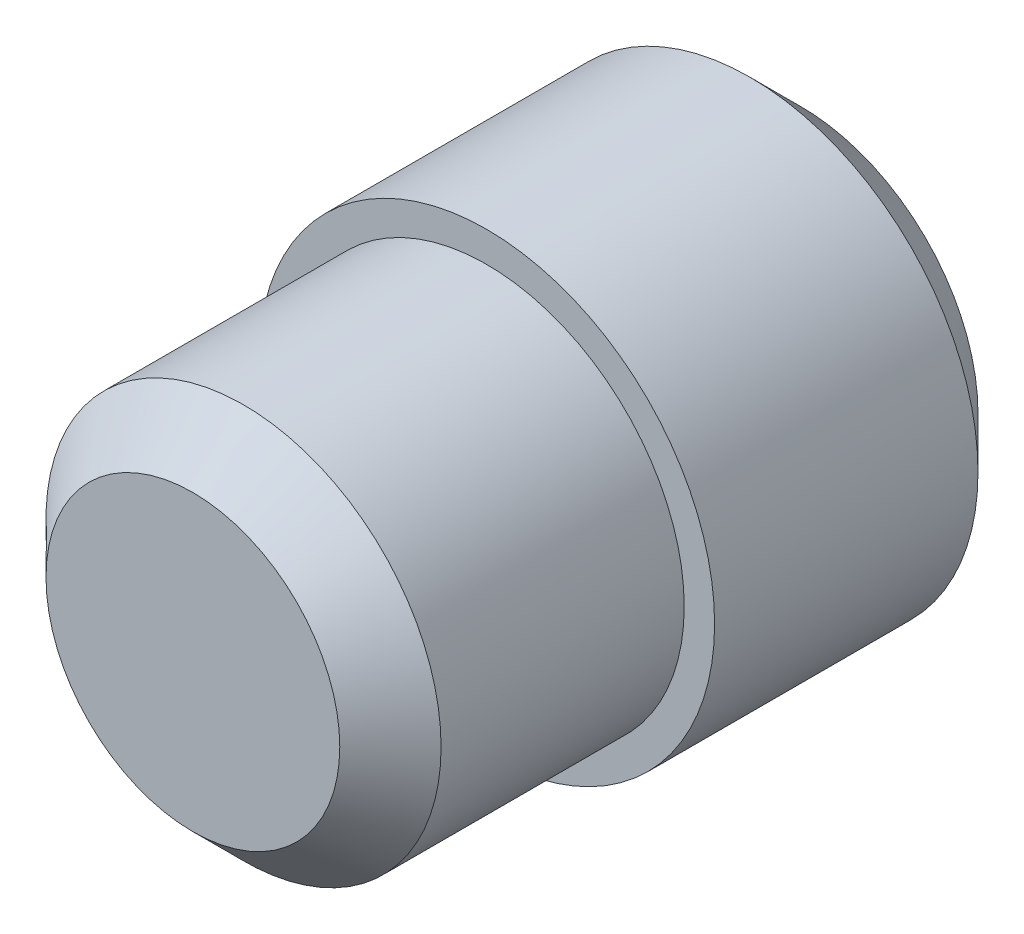
ISO-10303-21;
HEADER;
FILE_DESCRIPTION(('STEP AP214'),'2;1');
FILE_NAME('part.step','',(''),(''),'','','');
FILE_SCHEMA(('AUTOMOTIVE_DESIGN { 1 0 10303 214 1 1 1 1 }'));
ENDSEC;
DATA;
#1=APPLICATION_CONTEXT('core data for automotive mechanical design processes');
#2=APPLICATION_PROTOCOL_DEFINITION('international standard','automotive_design',2000,#1);
#3=PRODUCT_CONTEXT('',#1,'mechanical');
#4=PRODUCT('Part','Part','',(#3));
#5=PRODUCT_RELATED_PRODUCT_CATEGORY('part','',(#4));
#6=PRODUCT_DEFINITION_FORMATION('','',#4);
#7=PRODUCT_DEFINITION_CONTEXT('part definition',#1,'design');
#8=PRODUCT_DEFINITION('design','',#6,#7);
#9=PRODUCT_DEFINITION_SHAPE('','',#8);
#10=(LENGTH_UNIT() NAMED_UNIT(*) SI_UNIT(.MILLI.,.METRE.));
#11=(NAMED_UNIT(*) PLANE_ANGLE_UNIT() SI_UNIT($,.RADIAN.));
#12=(NAMED_UNIT(*) SI_UNIT($,.STERADIAN.) SOLID_ANGLE_UNIT());
#13=UNCERTAINTY_MEASURE_WITH_UNIT(LENGTH_MEASURE(1.E-05),#10,'distance_accuracy_value','');
#14=(GEOMETRIC_REPRESENTATION_CONTEXT(3) GLOBAL_UNCERTAINTY_ASSIGNED_CONTEXT((#13)) GLOBAL_UNIT_ASSIGNED_CONTEXT((#10,
#11,#12)) REPRESENTATION_CONTEXT('',''));
#15=CARTESIAN_POINT('',(0.,0.,0.));
#16=DIRECTION('',(0.,0.,1.));
#17=DIRECTION('',(1.,0.,0.));
#18=AXIS2_PLACEMENT_3D('',#15,#16,#17);
#19=CARTESIAN_POINT('',(0.,0.,3.1));
#20=DIRECTION('',(0.,0.,1.));
#21=DIRECTION('',(1.,0.,0.));
#22=AXIS2_PLACEMENT_3D('',#19,#20,#21);
#23=PLANE('',#22);
#24=CARTESIAN_POINT('',(0.,0.,3.1));
#25=DIRECTION('',(0.,0.,1.));
#26=DIRECTION('',(1.,0.,0.));
#27=AXIS2_PLACEMENT_3D('',#24,#25,#26);
#28=CIRCLE('',#27,2.25);
#29=CARTESIAN_POINT('',(-2.25,0.,3.1));
#30=VERTEX_POINT('',#29);
#31=EDGE_CURVE('E52',#30,#30,#28,.T.);
#32=ORIENTED_EDGE('',*,*,#31,.T.);
#33=EDGE_LOOP('',(#32));
#34=FACE_BOUND('',#33,.T.);
#35=CARTESIAN_POINT('',(0.,0.,3.1));
#36=DIRECTION('',(0.,0.,1.));
#37=DIRECTION('',(1.,0.,0.));
#38=AXIS2_PLACEMENT_3D('',#35,#36,#37);
#39=CIRCLE('',#38,1.95);
#40=CARTESIAN_POINT('',(1.95,0.,3.1));
#41=VERTEX_POINT('',#40);
#42=EDGE_CURVE('E55',#41,#41,#39,.T.);
#43=ORIENTED_EDGE('',*,*,#42,.F.);
#44=EDGE_LOOP('',(#43));
#45=FACE_BOUND('',#44,.T.);
#46=ADVANCED_FACE('F32',(#34,#45),#23,.T.);
#47=CARTESIAN_POINT('',(0.,0.,3.1));
#48=DIRECTION('',(0.,0.,-1.));
#49=DIRECTION('',(-1.,0.,0.));
#50=AXIS2_PLACEMENT_3D('',#47,#48,#49);
#51=CYLINDRICAL_SURFACE('',#50,2.25);
#52=CARTESIAN_POINT('',(0.,0.,0.500000000000005));
#53=DIRECTION('',(0.,0.,1.));
#54=DIRECTION('',(1.,0.,0.));
#55=AXIS2_PLACEMENT_3D('',#52,#53,#54);
#56=CIRCLE('',#55,2.25);
#57=CARTESIAN_POINT('',(-2.25,0.,0.500000000000005));
#58=VERTEX_POINT('',#57);
#59=EDGE_CURVE('E47',#58,#58,#56,.T.);
#60=CARTESIAN_POINT('',(-2.25,0.,0.500000000000005));
#61=CARTESIAN_POINT('',(-2.25,0.,0.527083333333338));
#62=CARTESIAN_POINT('',(-2.25,0.,0.554166666666671));
#63=CARTESIAN_POINT('',(-2.25,0.,0.608333333333338));
#64=CARTESIAN_POINT('',(-2.25,0.,0.635416666666671));
#65=CARTESIAN_POINT('',(-2.25,0.,0.689583333333338));
#66=CARTESIAN_POINT('',(-2.25,0.,0.716666666666671));
#67=CARTESIAN_POINT('',(-2.25,0.,0.770833333333338));
#68=CARTESIAN_POINT('',(-2.25,0.,0.797916666666671));
#69=CARTESIAN_POINT('',(-2.25,0.,0.852083333333337));
#70=CARTESIAN_POINT('',(-2.25,0.,0.879166666666671));
#71=CARTESIAN_POINT('',(-2.25,0.,0.933333333333337));
#72=CARTESIAN_POINT('',(-2.25,0.,0.960416666666671));
#73=CARTESIAN_POINT('',(-2.25,0.,1.01458333333334));
#74=CARTESIAN_POINT('',(-2.25,0.,1.04166666666667));
#75=CARTESIAN_POINT('',(-2.25,0.,1.09583333333334));
#76=CARTESIAN_POINT('',(-2.25,0.,1.12291666666667));
#77=CARTESIAN_POINT('',(-2.25,0.,1.17708333333334));
#78=CARTESIAN_POINT('',(-2.25,0.,1.20416666666667));
#79=CARTESIAN_POINT('',(-2.25,0.,1.25833333333334));
#80=CARTESIAN_POINT('',(-2.25,0.,1.28541666666667));
#81=CARTESIAN_POINT('',(-2.25,0.,1.33958333333334));
#82=CARTESIAN_POINT('',(-2.25,0.,1.36666666666667));
#83=CARTESIAN_POINT('',(-2.25,0.,1.42083333333334));
#84=CARTESIAN_POINT('',(-2.25,0.,1.44791666666667));
#85=CARTESIAN_POINT('',(-2.25,0.,1.50208333333334));
#86=CARTESIAN_POINT('',(-2.25,0.,1.52916666666667));
#87=CARTESIAN_POINT('',(-2.25,0.,1.58333333333334));
#88=CARTESIAN_POINT('',(-2.25,0.,1.61041666666667));
#89=CARTESIAN_POINT('',(-2.25,0.,1.66458333333334));
#90=CARTESIAN_POINT('',(-2.25,0.,1.69166666666667));
#91=CARTESIAN_POINT('',(-2.25,0.,1.74583333333334));
#92=CARTESIAN_POINT('',(-2.25,0.,1.77291666666667));
#93=CARTESIAN_POINT('',(-2.25,0.,1.82708333333334));
#94=CARTESIAN_POINT('',(-2.25,0.,1.85416666666667));
#95=CARTESIAN_POINT('',(-2.25,0.,1.90833333333334));
#96=CARTESIAN_POINT('',(-2.25,0.,1.93541666666667));
#97=CARTESIAN_POINT('',(-2.25,0.,1.98958333333334));
#98=CARTESIAN_POINT('',(-2.25,0.,2.01666666666667));
#99=CARTESIAN_POINT('',(-2.25,0.,2.07083333333334));
#100=CARTESIAN_POINT('',(-2.25,0.,2.09791666666667));
#101=CARTESIAN_POINT('',(-2.25,0.,2.15208333333333));
#102=CARTESIAN_POINT('',(-2.25,0.,2.17916666666667));
#103=CARTESIAN_POINT('',(-2.25,0.,2.23333333333333));
#104=CARTESIAN_POINT('',(-2.25,0.,2.26041666666667));
#105=CARTESIAN_POINT('',(-2.25,0.,2.31458333333333));
#106=CARTESIAN_POINT('',(-2.25,0.,2.34166666666667));
#107=CARTESIAN_POINT('',(-2.25,0.,2.39583333333333));
#108=CARTESIAN_POINT('',(-2.25,0.,2.42291666666667));
#109=CARTESIAN_POINT('',(-2.25,0.,2.47708333333333));
#110=CARTESIAN_POINT('',(-2.25,0.,2.50416666666667));
#111=CARTESIAN_POINT('',(-2.25,0.,2.55833333333333));
#112=CARTESIAN_POINT('',(-2.25,0.,2.58541666666667));
#113=CARTESIAN_POINT('',(-2.25,0.,2.63958333333333));
#114=CARTESIAN_POINT('',(-2.25,0.,2.66666666666667));
#115=CARTESIAN_POINT('',(-2.25,0.,2.72083333333333));
#116=CARTESIAN_POINT('',(-2.25,0.,2.74791666666667));
#117=CARTESIAN_POINT('',(-2.25,0.,2.80208333333333));
#118=CARTESIAN_POINT('',(-2.25,0.,2.82916666666667));
#119=CARTESIAN_POINT('',(-2.25,0.,2.88333333333333));
#120=CARTESIAN_POINT('',(-2.25,0.,2.91041666666667));
#121=CARTESIAN_POINT('',(-2.25,0.,2.96458333333333));
#122=CARTESIAN_POINT('',(-2.25,0.,2.99166666666667));
#123=CARTESIAN_POINT('',(-2.25,0.,3.04583333333333));
#124=CARTESIAN_POINT('',(-2.25,0.,3.07291666666667));
#125=CARTESIAN_POINT('',(-2.25,0.,3.1));
#126=B_SPLINE_CURVE_WITH_KNOTS('',3,(#60,#61,#62,#63,#64,#65,#66,#67,#68,#69,#70,#71,#72,#73,
#74,#75,#76,#77,#78,#79,#80,#81,#82,#83,#84,#85,#86,#87,#88,#89,#90,#91,#92,#93,#94,#95,#96,#97,
#98,#99,#100,#101,#102,#103,#104,#105,#106,#107,#108,#109,#110,#111,#112,#113,#114,#115,#116,
#117,#118,#119,#120,#121,#122,#123,#124,#125),.UNSPECIFIED.,.F.,.F.,(4,2,2,2,2,2,2,2,2,2,2,2,2,
2,2,2,2,2,2,2,2,2,2,2,2,2,2,2,2,2,2,2,4),(0.,0.0812499999999997,0.1625,0.24375,
0.324999999999999,0.406249999999999,0.487499999999999,0.568749999999999,0.649999999999998,
0.731249999999998,0.812499999999998,0.893749999999998,0.974999999999998,1.05625,1.1375,1.21875,
1.3,1.38125,1.4625,1.54375,1.625,1.70625,1.7875,1.86875,1.95,2.03125,2.1125,2.19375,2.275,
2.35624999999999,2.43749999999999,2.51874999999999,2.59999999999999),.UNSPECIFIED.);
#127=EDGE_CURVE('BSEAM62',#58,#30,#126,.T.);
#128=ORIENTED_EDGE('',*,*,#59,.T.);
#129=ORIENTED_EDGE('',*,*,#31,.F.);
#130=ORIENTED_EDGE('',*,*,#127,.T.);
#131=ORIENTED_EDGE('',*,*,#127,.F.);
#132=EDGE_LOOP('',(#128,#130,#129,#131));
#133=FACE_BOUND('',#132,.T.);
#134=ADVANCED_FACE('F62',(#133),#51,.T.);
#135=CARTESIAN_POINT('',(0.,0.,0.));
#136=DIRECTION('',(0.,0.,1.));
#137=DIRECTION('',(1.,0.,0.));
#138=AXIS2_PLACEMENT_3D('',#135,#136,#137);
#139=PLANE('',#138);
#140=CARTESIAN_POINT('',(0.,0.,0.));
#141=DIRECTION('',(0.,0.,1.));
#142=DIRECTION('',(1.,0.,0.));
#143=AXIS2_PLACEMENT_3D('',#140,#141,#142);
#144=CIRCLE('',#143,1.74999999999999);
#145=CARTESIAN_POINT('',(1.74999999999999,0.,0.));
#146=VERTEX_POINT('',#145);
#147=EDGE_CURVE('E43',#146,#146,#144,.F.);
#148=ORIENTED_EDGE('',*,*,#147,.T.);
#149=EDGE_LOOP('',(#148));
#150=FACE_BOUND('',#149,.T.);
#151=ADVANCED_FACE('F68',(#150),#139,.F.);
#152=CARTESIAN_POINT('',(0.,0.,6.));
#153=DIRECTION('',(0.,0.,-1.));
#154=DIRECTION('',(-1.,0.,0.));
#155=AXIS2_PLACEMENT_3D('',#152,#153,#154);
#156=CYLINDRICAL_SURFACE('',#155,1.95);
#157=CARTESIAN_POINT('',(0.,0.,5.5));
#158=DIRECTION('',(0.,0.,1.));
#159=DIRECTION('',(1.,0.,0.));
#160=AXIS2_PLACEMENT_3D('',#157,#158,#159);
#161=CIRCLE('',#160,1.95);
#162=CARTESIAN_POINT('',(1.95,0.,5.5));
#163=VERTEX_POINT('',#162);
#164=EDGE_CURVE('E10',#163,#163,#161,.F.);
#165=ORIENTED_EDGE('',*,*,#164,.T.);
#166=EDGE_LOOP('',(#165));
#167=FACE_BOUND('',#166,.T.);
#168=ORIENTED_EDGE('',*,*,#42,.T.);
#169=EDGE_LOOP('',(#168));
#170=FACE_BOUND('',#169,.T.);
#171=ADVANCED_FACE('F59',(#167,#170),#156,.T.);
#172=CARTESIAN_POINT('',(0.,0.,6.));
#173=DIRECTION('',(0.,0.,1.));
#174=DIRECTION('',(1.,0.,0.));
#175=AXIS2_PLACEMENT_3D('',#172,#173,#174);
#176=PLANE('',#175);
#177=CARTESIAN_POINT('',(0.,0.,6.));
#178=DIRECTION('',(0.,0.,1.));
#179=DIRECTION('',(1.,0.,0.));
#180=AXIS2_PLACEMENT_3D('',#177,#178,#179);
#181=CIRCLE('',#180,1.45);
#182=CARTESIAN_POINT('',(1.45,0.,6.));
#183=VERTEX_POINT('',#182);
#184=EDGE_CURVE('E39',#183,#183,#181,.T.);
#185=ORIENTED_EDGE('',*,*,#184,.T.);
#186=EDGE_LOOP('',(#185));
#187=FACE_BOUND('',#186,.T.);
#188=ADVANCED_FACE('F78',(#187),#176,.T.);
#189=CARTESIAN_POINT('',(0.,0.,0.500000000000005));
#190=DIRECTION('',(0.,0.,1.));
#191=DIRECTION('',(1.,0.,0.));
#192=AXIS2_PLACEMENT_3D('',#189,#190,#191);
#193=CONICAL_SURFACE('',#192,2.25,0.78539816339745);
#194=ORIENTED_EDGE('',*,*,#147,.F.);
#195=EDGE_LOOP('',(#194));
#196=FACE_BOUND('',#195,.T.);
#197=ORIENTED_EDGE('',*,*,#59,.F.);
#198=EDGE_LOOP('',(#197));
#199=FACE_BOUND('',#198,.T.);
#200=ADVANCED_FACE('F76',(#196,#199),#193,.T.);
#201=CARTESIAN_POINT('',(0.,0.,6.));
#202=DIRECTION('',(0.,0.,-1.));
#203=DIRECTION('',(-1.,0.,0.));
#204=AXIS2_PLACEMENT_3D('',#201,#202,#203);
#205=CONICAL_SURFACE('',#204,1.45,0.785398163397446);
#206=ORIENTED_EDGE('',*,*,#164,.F.);
#207=EDGE_LOOP('',(#206));
#208=FACE_BOUND('',#207,.T.);
#209=ORIENTED_EDGE('',*,*,#184,.F.);
#210=EDGE_LOOP('',(#209));
#211=FACE_BOUND('',#210,.T.);
#212=ADVANCED_FACE('F34',(#208,#211),#205,.T.);
#213=CLOSED_SHELL('',(#46,#134,#151,#171,#188,#200,#212));
#214=MANIFOLD_SOLID_BREP('B2',#213);
#215=ADVANCED_BREP_SHAPE_REPRESENTATION('',(#18,#214),#14);
#216=SHAPE_DEFINITION_REPRESENTATION(#9,#215);
ENDSEC;
END-ISO-10303-21;
